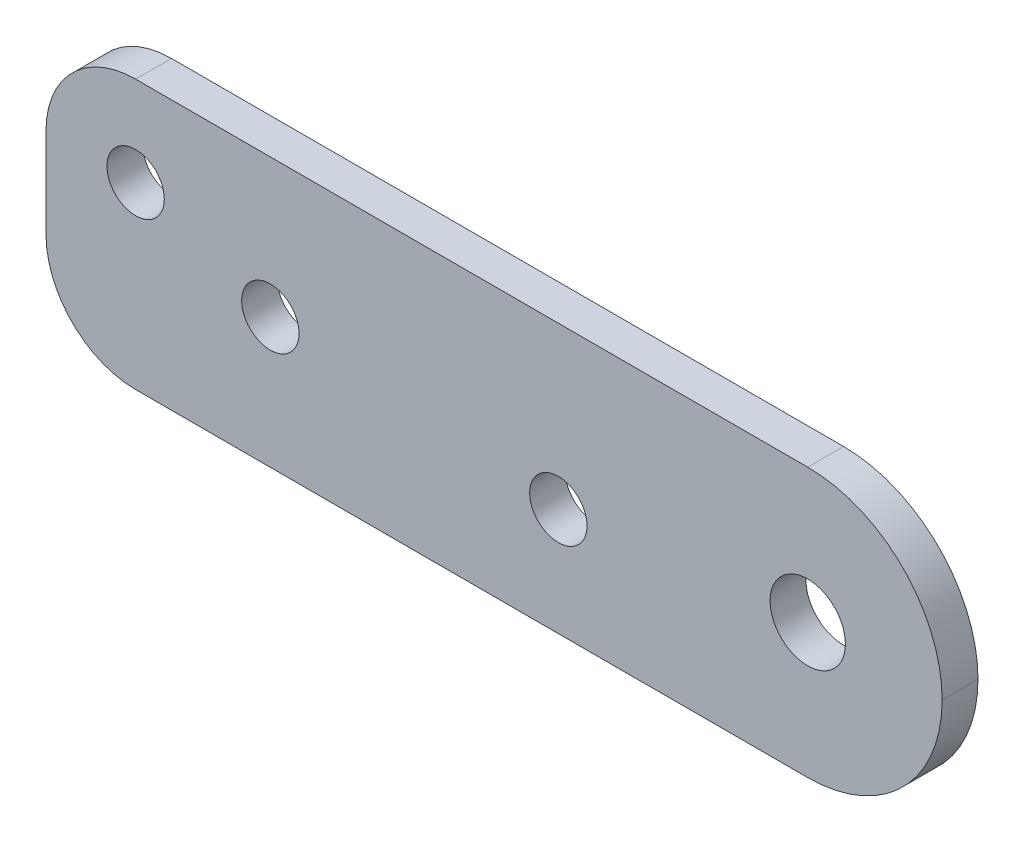
ISO-10303-21;
HEADER;
FILE_DESCRIPTION(('STEP AP214'),'2;1');
FILE_NAME('part.step','',(''),(''),'','','');
FILE_SCHEMA(('AUTOMOTIVE_DESIGN { 1 0 10303 214 1 1 1 1 }'));
ENDSEC;
DATA;
#1=APPLICATION_CONTEXT('core data for automotive mechanical design processes');
#2=APPLICATION_PROTOCOL_DEFINITION('international standard','automotive_design',2000,#1);
#3=PRODUCT_CONTEXT('',#1,'mechanical');
#4=PRODUCT('Part','Part','',(#3));
#5=PRODUCT_RELATED_PRODUCT_CATEGORY('part','',(#4));
#6=PRODUCT_DEFINITION_FORMATION('','',#4);
#7=PRODUCT_DEFINITION_CONTEXT('part definition',#1,'design');
#8=PRODUCT_DEFINITION('design','',#6,#7);
#9=PRODUCT_DEFINITION_SHAPE('','',#8);
#10=(LENGTH_UNIT() NAMED_UNIT(*) SI_UNIT(.MILLI.,.METRE.));
#11=(NAMED_UNIT(*) PLANE_ANGLE_UNIT() SI_UNIT($,.RADIAN.));
#12=(NAMED_UNIT(*) SI_UNIT($,.STERADIAN.) SOLID_ANGLE_UNIT());
#13=UNCERTAINTY_MEASURE_WITH_UNIT(LENGTH_MEASURE(1.E-05),#10,'distance_accuracy_value','');
#14=(GEOMETRIC_REPRESENTATION_CONTEXT(3) GLOBAL_UNCERTAINTY_ASSIGNED_CONTEXT((#13)) GLOBAL_UNIT_ASSIGNED_CONTEXT((#10,
#11,#12)) REPRESENTATION_CONTEXT('',''));
#15=CARTESIAN_POINT('',(0.,0.,0.));
#16=DIRECTION('',(0.,0.,1.));
#17=DIRECTION('',(1.,0.,0.));
#18=AXIS2_PLACEMENT_3D('',#15,#16,#17);
#19=CARTESIAN_POINT('',(-25.,7.5,-2.));
#20=DIRECTION('',(0.,-1.,0.));
#21=DIRECTION('',(0.,0.,1.));
#22=AXIS2_PLACEMENT_3D('',#19,#20,#21);
#23=PLANE('',#22);
#24=DIRECTION('',(-1.,0.,0.));
#25=VECTOR('',#24,1.);
#26=CARTESIAN_POINT('',(-25.,7.5,-2.));
#27=LINE('',#26,#25);
#28=CARTESIAN_POINT('',(17.5,7.5,-2.));
#29=VERTEX_POINT('',#28);
#30=CARTESIAN_POINT('',(-20.,7.5,-2.));
#31=VERTEX_POINT('',#30);
#32=EDGE_CURVE('E124',#29,#31,#27,.T.);
#33=ORIENTED_EDGE('',*,*,#32,.T.);
#34=DIRECTION('',(0.,0.,1.));
#35=VECTOR('',#34,1.);
#36=CARTESIAN_POINT('',(-20.,7.5,-2.));
#37=LINE('',#36,#35);
#38=CARTESIAN_POINT('',(-20.,7.5,0.));
#39=VERTEX_POINT('',#38);
#40=EDGE_CURVE('E141',#39,#31,#37,.F.);
#41=ORIENTED_EDGE('',*,*,#40,.F.);
#42=DIRECTION('',(-1.,0.,0.));
#43=VECTOR('',#42,1.);
#44=CARTESIAN_POINT('',(-25.,7.5,0.));
#45=LINE('',#44,#43);
#46=CARTESIAN_POINT('',(17.5,7.5,0.));
#47=VERTEX_POINT('',#46);
#48=EDGE_CURVE('E129',#47,#39,#45,.T.);
#49=ORIENTED_EDGE('',*,*,#48,.F.);
#50=DIRECTION('',(0.,0.,1.));
#51=VECTOR('',#50,1.);
#52=CARTESIAN_POINT('',(17.5,7.5,-2.));
#53=LINE('',#52,#51);
#54=EDGE_CURVE('E11',#29,#47,#53,.T.);
#55=ORIENTED_EDGE('',*,*,#54,.F.);
#56=EDGE_LOOP('',(#33,#41,#49,#55));
#57=FACE_BOUND('',#56,.T.);
#58=ADVANCED_FACE('F37',(#57),#23,.F.);
#59=CARTESIAN_POINT('',(-25.,-7.5,-2.));
#60=DIRECTION('',(1.,0.,0.));
#61=DIRECTION('',(0.,0.,1.));
#62=AXIS2_PLACEMENT_3D('',#59,#60,#61);
#63=PLANE('',#62);
#64=DIRECTION('',(0.,-1.,0.));
#65=VECTOR('',#64,1.);
#66=CARTESIAN_POINT('',(-25.,-7.5,0.));
#67=LINE('',#66,#65);
#68=CARTESIAN_POINT('',(-25.,2.5,0.));
#69=VERTEX_POINT('',#68);
#70=CARTESIAN_POINT('',(-25.,-2.5,0.));
#71=VERTEX_POINT('',#70);
#72=EDGE_CURVE('E104',#69,#71,#67,.T.);
#73=ORIENTED_EDGE('',*,*,#72,.F.);
#74=DIRECTION('',(0.,0.,1.));
#75=VECTOR('',#74,1.);
#76=CARTESIAN_POINT('',(-25.,2.5,-2.));
#77=LINE('',#76,#75);
#78=CARTESIAN_POINT('',(-25.,2.5,-2.));
#79=VERTEX_POINT('',#78);
#80=EDGE_CURVE('E108',#79,#69,#77,.T.);
#81=ORIENTED_EDGE('',*,*,#80,.F.);
#82=DIRECTION('',(0.,-1.,0.));
#83=VECTOR('',#82,1.);
#84=CARTESIAN_POINT('',(-25.,-7.5,-2.));
#85=LINE('',#84,#83);
#86=CARTESIAN_POINT('',(-25.,-2.5,-2.));
#87=VERTEX_POINT('',#86);
#88=EDGE_CURVE('E127',#79,#87,#85,.T.);
#89=ORIENTED_EDGE('',*,*,#88,.T.);
#90=DIRECTION('',(0.,0.,1.));
#91=VECTOR('',#90,1.);
#92=CARTESIAN_POINT('',(-25.,-2.5,-2.));
#93=LINE('',#92,#91);
#94=EDGE_CURVE('E136',#71,#87,#93,.F.);
#95=ORIENTED_EDGE('',*,*,#94,.F.);
#96=EDGE_LOOP('',(#73,#81,#89,#95));
#97=FACE_BOUND('',#96,.T.);
#98=ADVANCED_FACE('F179',(#97),#63,.F.);
#99=CARTESIAN_POINT('',(-25.,-7.5,-2.));
#100=DIRECTION('',(0.,1.,0.));
#101=DIRECTION('',(0.,0.,-1.));
#102=AXIS2_PLACEMENT_3D('',#99,#100,#101);
#103=PLANE('',#102);
#104=DIRECTION('',(1.,0.,0.));
#105=VECTOR('',#104,1.);
#106=CARTESIAN_POINT('',(-25.,-7.5,0.));
#107=LINE('',#106,#105);
#108=CARTESIAN_POINT('',(-20.,-7.5,0.));
#109=VERTEX_POINT('',#108);
#110=CARTESIAN_POINT('',(17.5,-7.5,0.));
#111=VERTEX_POINT('',#110);
#112=EDGE_CURVE('E102',#109,#111,#107,.T.);
#113=ORIENTED_EDGE('',*,*,#112,.F.);
#114=DIRECTION('',(0.,0.,1.));
#115=VECTOR('',#114,1.);
#116=CARTESIAN_POINT('',(-20.,-7.5,-2.));
#117=LINE('',#116,#115);
#118=CARTESIAN_POINT('',(-20.,-7.5,-2.));
#119=VERTEX_POINT('',#118);
#120=EDGE_CURVE('E112',#119,#109,#117,.T.);
#121=ORIENTED_EDGE('',*,*,#120,.F.);
#122=DIRECTION('',(1.,0.,0.));
#123=VECTOR('',#122,1.);
#124=CARTESIAN_POINT('',(-25.,-7.5,-2.));
#125=LINE('',#124,#123);
#126=CARTESIAN_POINT('',(17.5,-7.5,-2.));
#127=VERTEX_POINT('',#126);
#128=EDGE_CURVE('E118',#119,#127,#125,.T.);
#129=ORIENTED_EDGE('',*,*,#128,.T.);
#130=DIRECTION('',(0.,0.,1.));
#131=VECTOR('',#130,1.);
#132=CARTESIAN_POINT('',(17.5,-7.5,-2.));
#133=LINE('',#132,#131);
#134=EDGE_CURVE('E123',#111,#127,#133,.F.);
#135=ORIENTED_EDGE('',*,*,#134,.F.);
#136=EDGE_LOOP('',(#113,#121,#129,#135));
#137=FACE_BOUND('',#136,.T.);
#138=ADVANCED_FACE('F121',(#137),#103,.F.);
#139=CARTESIAN_POINT('',(0.,0.,-2.));
#140=DIRECTION('',(0.,0.,1.));
#141=DIRECTION('',(-1.,0.,0.));
#142=AXIS2_PLACEMENT_3D('',#139,#140,#141);
#143=PLANE('',#142);
#144=CARTESIAN_POINT('',(3.58427203237196,-1.50000000000001,-2.));
#145=DIRECTION('',(0.,0.,1.));
#146=DIRECTION('',(1.,0.,0.));
#147=AXIS2_PLACEMENT_3D('',#144,#145,#146);
#148=CIRCLE('',#147,1.6);
#149=CARTESIAN_POINT('',(5.18427203237196,-1.50000000000001,-2.));
#150=VERTEX_POINT('',#149);
#151=EDGE_CURVE('E296',#150,#150,#148,.T.);
#152=ORIENTED_EDGE('',*,*,#151,.T.);
#153=EDGE_LOOP('',(#152));
#154=FACE_BOUND('',#153,.T.);
#155=CARTESIAN_POINT('',(-12.4824590337127,-0.236161146605326,-2.));
#156=DIRECTION('',(0.,0.,1.));
#157=DIRECTION('',(1.,0.,0.));
#158=AXIS2_PLACEMENT_3D('',#155,#156,#157);
#159=CIRCLE('',#158,1.6);
#160=CARTESIAN_POINT('',(-10.8824590337127,-0.236161146605326,-2.));
#161=VERTEX_POINT('',#160);
#162=EDGE_CURVE('E301',#161,#161,#159,.T.);
#163=ORIENTED_EDGE('',*,*,#162,.T.);
#164=EDGE_LOOP('',(#163));
#165=FACE_BOUND('',#164,.T.);
#166=CARTESIAN_POINT('',(17.5,0.,-2.));
#167=DIRECTION('',(0.,0.,1.));
#168=DIRECTION('',(1.,0.,0.));
#169=AXIS2_PLACEMENT_3D('',#166,#167,#168);
#170=CIRCLE('',#169,2.1);
#171=CARTESIAN_POINT('',(19.6,0.,-2.));
#172=VERTEX_POINT('',#171);
#173=EDGE_CURVE('E161',#172,#172,#170,.T.);
#174=ORIENTED_EDGE('',*,*,#173,.T.);
#175=EDGE_LOOP('',(#174));
#176=FACE_BOUND('',#175,.T.);
#177=CARTESIAN_POINT('',(-20.,2.5,-2.));
#178=DIRECTION('',(0.,0.,1.));
#179=DIRECTION('',(1.,0.,0.));
#180=AXIS2_PLACEMENT_3D('',#177,#178,#179);
#181=CIRCLE('',#180,1.6);
#182=CARTESIAN_POINT('',(-18.4,2.5,-2.));
#183=VERTEX_POINT('',#182);
#184=EDGE_CURVE('E153',#183,#183,#181,.T.);
#185=ORIENTED_EDGE('',*,*,#184,.T.);
#186=EDGE_LOOP('',(#185));
#187=FACE_BOUND('',#186,.T.);
#188=ORIENTED_EDGE('',*,*,#128,.F.);
#189=CARTESIAN_POINT('',(-20.,-2.5,-2.));
#190=DIRECTION('',(0.,0.,-1.));
#191=DIRECTION('',(-1.,0.,0.));
#192=AXIS2_PLACEMENT_3D('',#189,#190,#191);
#193=CIRCLE('',#192,5.);
#194=EDGE_CURVE('E114',#87,#119,#193,.F.);
#195=ORIENTED_EDGE('',*,*,#194,.F.);
#196=ORIENTED_EDGE('',*,*,#88,.F.);
#197=CARTESIAN_POINT('',(-20.,2.5,-2.));
#198=DIRECTION('',(0.,0.,-1.));
#199=DIRECTION('',(-1.,0.,0.));
#200=AXIS2_PLACEMENT_3D('',#197,#198,#199);
#201=CIRCLE('',#200,5.);
#202=EDGE_CURVE('E138',#31,#79,#201,.F.);
#203=ORIENTED_EDGE('',*,*,#202,.F.);
#204=ORIENTED_EDGE('',*,*,#32,.F.);
#205=CARTESIAN_POINT('',(17.5,0.,-2.));
#206=DIRECTION('',(0.,0.,-1.));
#207=DIRECTION('',(-1.,0.,0.));
#208=AXIS2_PLACEMENT_3D('',#205,#206,#207);
#209=CIRCLE('',#208,7.5);
#210=CARTESIAN_POINT('',(25.,0.,-2.));
#211=VERTEX_POINT('',#210);
#212=EDGE_CURVE('E53',#211,#29,#209,.F.);
#213=ORIENTED_EDGE('',*,*,#212,.F.);
#214=CARTESIAN_POINT('',(17.5,0.,-2.));
#215=DIRECTION('',(0.,0.,-1.));
#216=DIRECTION('',(-1.,0.,0.));
#217=AXIS2_PLACEMENT_3D('',#214,#215,#216);
#218=CIRCLE('',#217,7.5);
#219=EDGE_CURVE('E46',#127,#211,#218,.F.);
#220=ORIENTED_EDGE('',*,*,#219,.F.);
#221=EDGE_LOOP('',(#188,#195,#196,#203,#204,#213,#220));
#222=FACE_BOUND('',#221,.T.);
#223=ADVANCED_FACE('F167',(#154,#165,#176,#187,#222),#143,.F.);
#224=CARTESIAN_POINT('',(0.,0.,0.));
#225=DIRECTION('',(0.,0.,1.));
#226=DIRECTION('',(-1.,0.,0.));
#227=AXIS2_PLACEMENT_3D('',#224,#225,#226);
#228=PLANE('',#227);
#229=CARTESIAN_POINT('',(3.58427203237196,-1.50000000000001,0.));
#230=DIRECTION('',(0.,0.,-1.));
#231=DIRECTION('',(-1.,0.,0.));
#232=AXIS2_PLACEMENT_3D('',#229,#230,#231);
#233=CIRCLE('',#232,1.6);
#234=CARTESIAN_POINT('',(1.98427203237196,-1.50000000000001,0.));
#235=VERTEX_POINT('',#234);
#236=EDGE_CURVE('E41',#235,#235,#233,.T.);
#237=ORIENTED_EDGE('',*,*,#236,.T.);
#238=EDGE_LOOP('',(#237));
#239=FACE_BOUND('',#238,.T.);
#240=CARTESIAN_POINT('',(-12.4824590337127,-0.236161146605326,0.));
#241=DIRECTION('',(0.,0.,1.));
#242=DIRECTION('',(1.,0.,0.));
#243=AXIS2_PLACEMENT_3D('',#240,#241,#242);
#244=CIRCLE('',#243,1.6);
#245=CARTESIAN_POINT('',(-10.8824590337127,-0.236161146605326,0.));
#246=VERTEX_POINT('',#245);
#247=EDGE_CURVE('E158',#246,#246,#244,.T.);
#248=ORIENTED_EDGE('',*,*,#247,.F.);
#249=EDGE_LOOP('',(#248));
#250=FACE_BOUND('',#249,.T.);
#251=CARTESIAN_POINT('',(17.5,0.,0.));
#252=DIRECTION('',(0.,0.,1.));
#253=DIRECTION('',(1.,0.,0.));
#254=AXIS2_PLACEMENT_3D('',#251,#252,#253);
#255=CIRCLE('',#254,2.1);
#256=CARTESIAN_POINT('',(19.6,0.,0.));
#257=VERTEX_POINT('',#256);
#258=EDGE_CURVE('E303',#257,#257,#255,.T.);
#259=ORIENTED_EDGE('',*,*,#258,.F.);
#260=EDGE_LOOP('',(#259));
#261=FACE_BOUND('',#260,.T.);
#262=CARTESIAN_POINT('',(-20.,2.5,0.));
#263=DIRECTION('',(0.,0.,1.));
#264=DIRECTION('',(1.,0.,0.));
#265=AXIS2_PLACEMENT_3D('',#262,#263,#264);
#266=CIRCLE('',#265,1.6);
#267=CARTESIAN_POINT('',(-18.4,2.5,0.));
#268=VERTEX_POINT('',#267);
#269=EDGE_CURVE('E150',#268,#268,#266,.T.);
#270=ORIENTED_EDGE('',*,*,#269,.F.);
#271=EDGE_LOOP('',(#270));
#272=FACE_BOUND('',#271,.T.);
#273=CARTESIAN_POINT('',(17.5,0.,0.));
#274=DIRECTION('',(0.,0.,-1.));
#275=DIRECTION('',(-1.,0.,0.));
#276=AXIS2_PLACEMENT_3D('',#273,#274,#275);
#277=CIRCLE('',#276,7.5);
#278=CARTESIAN_POINT('',(25.,0.,0.));
#279=VERTEX_POINT('',#278);
#280=EDGE_CURVE('E144',#47,#279,#277,.T.);
#281=ORIENTED_EDGE('',*,*,#280,.F.);
#282=ORIENTED_EDGE('',*,*,#48,.T.);
#283=CARTESIAN_POINT('',(-20.,2.5,0.));
#284=DIRECTION('',(0.,0.,-1.));
#285=DIRECTION('',(-1.,0.,0.));
#286=AXIS2_PLACEMENT_3D('',#283,#284,#285);
#287=CIRCLE('',#286,5.);
#288=EDGE_CURVE('E109',#69,#39,#287,.T.);
#289=ORIENTED_EDGE('',*,*,#288,.F.);
#290=ORIENTED_EDGE('',*,*,#72,.T.);
#291=CARTESIAN_POINT('',(-20.,-2.5,0.));
#292=DIRECTION('',(0.,0.,-1.));
#293=DIRECTION('',(-1.,0.,0.));
#294=AXIS2_PLACEMENT_3D('',#291,#292,#293);
#295=CIRCLE('',#294,5.);
#296=EDGE_CURVE('E97',#109,#71,#295,.T.);
#297=ORIENTED_EDGE('',*,*,#296,.F.);
#298=ORIENTED_EDGE('',*,*,#112,.T.);
#299=CARTESIAN_POINT('',(17.5,0.,0.));
#300=DIRECTION('',(0.,0.,-1.));
#301=DIRECTION('',(-1.,0.,0.));
#302=AXIS2_PLACEMENT_3D('',#299,#300,#301);
#303=CIRCLE('',#302,7.5);
#304=EDGE_CURVE('E146',#279,#111,#303,.T.);
#305=ORIENTED_EDGE('',*,*,#304,.F.);
#306=EDGE_LOOP('',(#281,#282,#289,#290,#297,#298,#305));
#307=FACE_BOUND('',#306,.T.);
#308=ADVANCED_FACE('F99',(#239,#250,#261,#272,#307),#228,.T.);
#309=CARTESIAN_POINT('',(-20.,-2.5,-2.));
#310=DIRECTION('',(0.,0.,1.));
#311=DIRECTION('',(-1.,0.,0.));
#312=AXIS2_PLACEMENT_3D('',#309,#310,#311);
#313=CYLINDRICAL_SURFACE('',#312,5.);
#314=ORIENTED_EDGE('',*,*,#194,.T.);
#315=ORIENTED_EDGE('',*,*,#120,.T.);
#316=ORIENTED_EDGE('',*,*,#296,.T.);
#317=ORIENTED_EDGE('',*,*,#94,.T.);
#318=EDGE_LOOP('',(#314,#315,#316,#317));
#319=FACE_BOUND('',#318,.T.);
#320=ADVANCED_FACE('F113',(#319),#313,.T.);
#321=CARTESIAN_POINT('',(-20.,2.5,-2.));
#322=DIRECTION('',(0.,0.,1.));
#323=DIRECTION('',(-1.,0.,0.));
#324=AXIS2_PLACEMENT_3D('',#321,#322,#323);
#325=CYLINDRICAL_SURFACE('',#324,5.);
#326=ORIENTED_EDGE('',*,*,#202,.T.);
#327=ORIENTED_EDGE('',*,*,#80,.T.);
#328=ORIENTED_EDGE('',*,*,#288,.T.);
#329=ORIENTED_EDGE('',*,*,#40,.T.);
#330=EDGE_LOOP('',(#326,#327,#328,#329));
#331=FACE_BOUND('',#330,.T.);
#332=ADVANCED_FACE('F177',(#331),#325,.T.);
#333=CARTESIAN_POINT('',(17.5,0.,-2.));
#334=DIRECTION('',(0.,0.,1.));
#335=DIRECTION('',(-1.,0.,0.));
#336=AXIS2_PLACEMENT_3D('',#333,#334,#335);
#337=CYLINDRICAL_SURFACE('',#336,7.5);
#338=ORIENTED_EDGE('',*,*,#54,.T.);
#339=ORIENTED_EDGE('',*,*,#280,.T.);
#340=DIRECTION('',(0.,0.,1.));
#341=VECTOR('',#340,1.);
#342=CARTESIAN_POINT('',(25.,0.,-2.));
#343=LINE('',#342,#341);
#344=EDGE_CURVE('E58',#279,#211,#343,.F.);
#345=ORIENTED_EDGE('',*,*,#344,.T.);
#346=ORIENTED_EDGE('',*,*,#212,.T.);
#347=EDGE_LOOP('',(#338,#339,#345,#346));
#348=FACE_BOUND('',#347,.T.);
#349=ADVANCED_FACE('F39',(#348),#337,.T.);
#350=CARTESIAN_POINT('',(17.5,0.,-2.));
#351=DIRECTION('',(0.,0.,1.));
#352=DIRECTION('',(-1.,0.,0.));
#353=AXIS2_PLACEMENT_3D('',#350,#351,#352);
#354=CYLINDRICAL_SURFACE('',#353,7.5);
#355=ORIENTED_EDGE('',*,*,#219,.T.);
#356=ORIENTED_EDGE('',*,*,#344,.F.);
#357=ORIENTED_EDGE('',*,*,#304,.T.);
#358=ORIENTED_EDGE('',*,*,#134,.T.);
#359=EDGE_LOOP('',(#355,#356,#357,#358));
#360=FACE_BOUND('',#359,.T.);
#361=ADVANCED_FACE('F171',(#360),#354,.T.);
#362=CARTESIAN_POINT('',(-20.,2.5,0.));
#363=DIRECTION('',(0.,0.,-1.));
#364=DIRECTION('',(1.,0.,0.));
#365=AXIS2_PLACEMENT_3D('',#362,#363,#364);
#366=CYLINDRICAL_SURFACE('',#365,1.6);
#367=ORIENTED_EDGE('',*,*,#269,.T.);
#368=EDGE_LOOP('',(#367));
#369=FACE_BOUND('',#368,.T.);
#370=ORIENTED_EDGE('',*,*,#184,.F.);
#371=EDGE_LOOP('',(#370));
#372=FACE_BOUND('',#371,.T.);
#373=ADVANCED_FACE('F194',(#369,#372),#366,.F.);
#374=CARTESIAN_POINT('',(17.5,0.,0.));
#375=DIRECTION('',(0.,0.,-1.));
#376=DIRECTION('',(1.,0.,0.));
#377=AXIS2_PLACEMENT_3D('',#374,#375,#376);
#378=CYLINDRICAL_SURFACE('',#377,2.1);
#379=ORIENTED_EDGE('',*,*,#258,.T.);
#380=EDGE_LOOP('',(#379));
#381=FACE_BOUND('',#380,.T.);
#382=ORIENTED_EDGE('',*,*,#173,.F.);
#383=EDGE_LOOP('',(#382));
#384=FACE_BOUND('',#383,.T.);
#385=ADVANCED_FACE('F199',(#381,#384),#378,.F.);
#386=CARTESIAN_POINT('',(-12.4824590337127,-0.236161146605326,0.));
#387=DIRECTION('',(0.,0.,-1.));
#388=DIRECTION('',(1.,0.,0.));
#389=AXIS2_PLACEMENT_3D('',#386,#387,#388);
#390=CYLINDRICAL_SURFACE('',#389,1.6);
#391=ORIENTED_EDGE('',*,*,#247,.T.);
#392=EDGE_LOOP('',(#391));
#393=FACE_BOUND('',#392,.T.);
#394=ORIENTED_EDGE('',*,*,#162,.F.);
#395=EDGE_LOOP('',(#394));
#396=FACE_BOUND('',#395,.T.);
#397=ADVANCED_FACE('F267',(#393,#396),#390,.F.);
#398=CARTESIAN_POINT('',(3.58427203237196,-1.50000000000001,8.));
#399=DIRECTION('',(0.,0.,-1.));
#400=DIRECTION('',(1.,0.,0.));
#401=AXIS2_PLACEMENT_3D('',#398,#399,#400);
#402=CYLINDRICAL_SURFACE('',#401,1.6);
#403=ORIENTED_EDGE('',*,*,#236,.F.);
#404=EDGE_LOOP('',(#403));
#405=FACE_BOUND('',#404,.T.);
#406=ORIENTED_EDGE('',*,*,#151,.F.);
#407=EDGE_LOOP('',(#406));
#408=FACE_BOUND('',#407,.T.);
#409=ADVANCED_FACE('F276',(#405,#408),#402,.F.);
#410=CLOSED_SHELL('',(#58,#98,#138,#223,#308,#320,#332,#349,#361,#373,#385,#397,#409));
#411=MANIFOLD_SOLID_BREP('B2',#410);
#412=ADVANCED_BREP_SHAPE_REPRESENTATION('',(#18,#411),#14);
#413=SHAPE_DEFINITION_REPRESENTATION(#9,#412);
ENDSEC;
END-ISO-10303-21;
